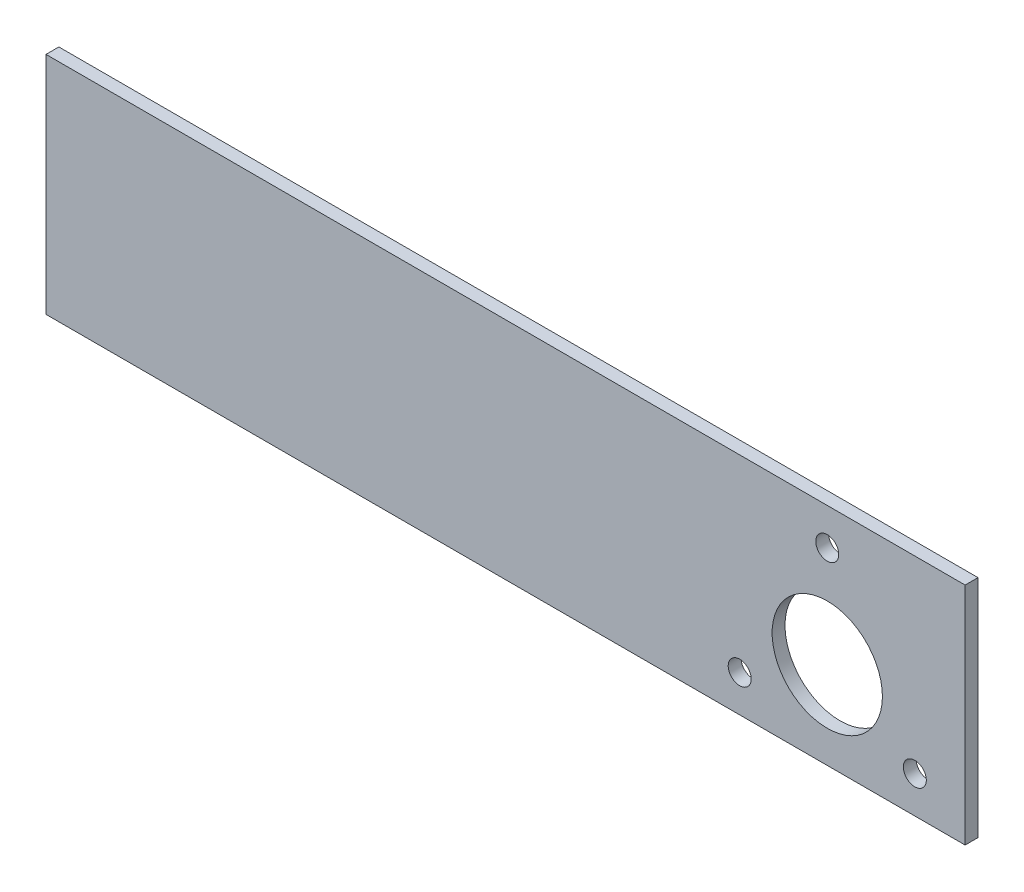
ISO-10303-21;
HEADER;
FILE_DESCRIPTION(('STEP AP214'),'2;1');
FILE_NAME('part.step','',(''),(''),'','','');
FILE_SCHEMA(('AUTOMOTIVE_DESIGN { 1 0 10303 214 1 1 1 1 }'));
ENDSEC;
DATA;
#1=APPLICATION_CONTEXT('core data for automotive mechanical design processes');
#2=APPLICATION_PROTOCOL_DEFINITION('international standard','automotive_design',2000,#1);
#3=PRODUCT_CONTEXT('',#1,'mechanical');
#4=PRODUCT('Part','Part','',(#3));
#5=PRODUCT_RELATED_PRODUCT_CATEGORY('part','',(#4));
#6=PRODUCT_DEFINITION_FORMATION('','',#4);
#7=PRODUCT_DEFINITION_CONTEXT('part definition',#1,'design');
#8=PRODUCT_DEFINITION('design','',#6,#7);
#9=PRODUCT_DEFINITION_SHAPE('','',#8);
#10=(LENGTH_UNIT() NAMED_UNIT(*) SI_UNIT(.MILLI.,.METRE.));
#11=(NAMED_UNIT(*) PLANE_ANGLE_UNIT() SI_UNIT($,.RADIAN.));
#12=(NAMED_UNIT(*) SI_UNIT($,.STERADIAN.) SOLID_ANGLE_UNIT());
#13=UNCERTAINTY_MEASURE_WITH_UNIT(LENGTH_MEASURE(1.E-05),#10,'distance_accuracy_value','');
#14=(GEOMETRIC_REPRESENTATION_CONTEXT(3) GLOBAL_UNCERTAINTY_ASSIGNED_CONTEXT((#13)) GLOBAL_UNIT_ASSIGNED_CONTEXT((#10,
#11,#12)) REPRESENTATION_CONTEXT('',''));
#15=CARTESIAN_POINT('',(0.,0.,0.));
#16=DIRECTION('',(0.,0.,1.));
#17=DIRECTION('',(1.,0.,0.));
#18=AXIS2_PLACEMENT_3D('',#15,#16,#17);
#19=CARTESIAN_POINT('',(-85.,-9.5,-1.4));
#20=DIRECTION('',(-1.,0.,0.));
#21=DIRECTION('',(0.,0.,1.));
#22=AXIS2_PLACEMENT_3D('',#19,#20,#21);
#23=PLANE('',#22);
#24=DIRECTION('',(0.,-1.,0.));
#25=VECTOR('',#24,1.);
#26=CARTESIAN_POINT('',(-85.,-9.5,0.));
#27=LINE('',#26,#25);
#28=CARTESIAN_POINT('',(-85.,15.,0.));
#29=VERTEX_POINT('',#28);
#30=CARTESIAN_POINT('',(-85.,-9.5,0.));
#31=VERTEX_POINT('',#30);
#32=EDGE_CURVE('E104',#29,#31,#27,.T.);
#33=ORIENTED_EDGE('',*,*,#32,.F.);
#34=DIRECTION('',(0.,0.,1.));
#35=VECTOR('',#34,1.);
#36=CARTESIAN_POINT('',(-85.,15.,-1.4));
#37=LINE('',#36,#35);
#38=CARTESIAN_POINT('',(-85.,15.,-1.4));
#39=VERTEX_POINT('',#38);
#40=EDGE_CURVE('E11',#39,#29,#37,.T.);
#41=ORIENTED_EDGE('',*,*,#40,.F.);
#42=DIRECTION('',(0.,-1.,0.));
#43=VECTOR('',#42,1.);
#44=CARTESIAN_POINT('',(-85.,-9.5,-1.4));
#45=LINE('',#44,#43);
#46=CARTESIAN_POINT('',(-85.,-9.5,-1.4));
#47=VERTEX_POINT('',#46);
#48=EDGE_CURVE('E97',#39,#47,#45,.T.);
#49=ORIENTED_EDGE('',*,*,#48,.T.);
#50=DIRECTION('',(0.,0.,1.));
#51=VECTOR('',#50,1.);
#52=CARTESIAN_POINT('',(-85.,-9.5,-1.4));
#53=LINE('',#52,#51);
#54=EDGE_CURVE('E42',#47,#31,#53,.T.);
#55=ORIENTED_EDGE('',*,*,#54,.T.);
#56=EDGE_LOOP('',(#33,#41,#49,#55));
#57=FACE_BOUND('',#56,.T.);
#58=ADVANCED_FACE('F39',(#57),#23,.T.);
#59=CARTESIAN_POINT('',(-85.,15.,-1.4));
#60=DIRECTION('',(0.,1.,0.));
#61=DIRECTION('',(-1.,0.,0.));
#62=AXIS2_PLACEMENT_3D('',#59,#60,#61);
#63=PLANE('',#62);
#64=DIRECTION('',(-1.,0.,0.));
#65=VECTOR('',#64,1.);
#66=CARTESIAN_POINT('',(-85.,15.,0.));
#67=LINE('',#66,#65);
#68=CARTESIAN_POINT('',(15.,15.,0.));
#69=VERTEX_POINT('',#68);
#70=EDGE_CURVE('E99',#69,#29,#67,.T.);
#71=ORIENTED_EDGE('',*,*,#70,.F.);
#72=DIRECTION('',(0.,0.,1.));
#73=VECTOR('',#72,1.);
#74=CARTESIAN_POINT('',(15.,15.,-1.4));
#75=LINE('',#74,#73);
#76=CARTESIAN_POINT('',(15.,15.,-1.4));
#77=VERTEX_POINT('',#76);
#78=EDGE_CURVE('E48',#77,#69,#75,.T.);
#79=ORIENTED_EDGE('',*,*,#78,.F.);
#80=DIRECTION('',(-1.,0.,0.));
#81=VECTOR('',#80,1.);
#82=CARTESIAN_POINT('',(-85.,15.,-1.4));
#83=LINE('',#82,#81);
#84=EDGE_CURVE('E94',#77,#39,#83,.T.);
#85=ORIENTED_EDGE('',*,*,#84,.T.);
#86=ORIENTED_EDGE('',*,*,#40,.T.);
#87=EDGE_LOOP('',(#71,#79,#85,#86));
#88=FACE_BOUND('',#87,.T.);
#89=ADVANCED_FACE('F115',(#88),#63,.T.);
#90=CARTESIAN_POINT('',(15.,-9.5,-1.4));
#91=DIRECTION('',(1.,0.,0.));
#92=DIRECTION('',(0.,0.,-1.));
#93=AXIS2_PLACEMENT_3D('',#90,#91,#92);
#94=PLANE('',#93);
#95=DIRECTION('',(0.,1.,0.));
#96=VECTOR('',#95,1.);
#97=CARTESIAN_POINT('',(15.,-9.5,0.));
#98=LINE('',#97,#96);
#99=CARTESIAN_POINT('',(15.,-9.5,0.));
#100=VERTEX_POINT('',#99);
#101=EDGE_CURVE('E89',#100,#69,#98,.T.);
#102=ORIENTED_EDGE('',*,*,#101,.F.);
#103=DIRECTION('',(0.,0.,1.));
#104=VECTOR('',#103,1.);
#105=CARTESIAN_POINT('',(15.,-9.5,-1.4));
#106=LINE('',#105,#104);
#107=CARTESIAN_POINT('',(15.,-9.5,-1.4));
#108=VERTEX_POINT('',#107);
#109=EDGE_CURVE('E84',#108,#100,#106,.T.);
#110=ORIENTED_EDGE('',*,*,#109,.F.);
#111=DIRECTION('',(0.,1.,0.));
#112=VECTOR('',#111,1.);
#113=CARTESIAN_POINT('',(15.,-9.5,-1.4));
#114=LINE('',#113,#112);
#115=EDGE_CURVE('E87',#108,#77,#114,.T.);
#116=ORIENTED_EDGE('',*,*,#115,.T.);
#117=ORIENTED_EDGE('',*,*,#78,.T.);
#118=EDGE_LOOP('',(#102,#110,#116,#117));
#119=FACE_BOUND('',#118,.T.);
#120=ADVANCED_FACE('F86',(#119),#94,.T.);
#121=CARTESIAN_POINT('',(-85.,-9.5,-1.4));
#122=DIRECTION('',(0.,-1.,0.));
#123=DIRECTION('',(0.,0.,-1.));
#124=AXIS2_PLACEMENT_3D('',#121,#122,#123);
#125=PLANE('',#124);
#126=DIRECTION('',(1.,0.,0.));
#127=VECTOR('',#126,1.);
#128=CARTESIAN_POINT('',(-85.,-9.5,0.));
#129=LINE('',#128,#127);
#130=EDGE_CURVE('E107',#31,#100,#129,.T.);
#131=ORIENTED_EDGE('',*,*,#130,.F.);
#132=ORIENTED_EDGE('',*,*,#54,.F.);
#133=DIRECTION('',(1.,0.,0.));
#134=VECTOR('',#133,1.);
#135=CARTESIAN_POINT('',(-85.,-9.5,-1.4));
#136=LINE('',#135,#134);
#137=EDGE_CURVE('E93',#47,#108,#136,.T.);
#138=ORIENTED_EDGE('',*,*,#137,.T.);
#139=ORIENTED_EDGE('',*,*,#109,.T.);
#140=EDGE_LOOP('',(#131,#132,#138,#139));
#141=FACE_BOUND('',#140,.T.);
#142=ADVANCED_FACE('F96',(#141),#125,.T.);
#143=CARTESIAN_POINT('',(0.,0.,-1.4));
#144=DIRECTION('',(0.,0.,-1.));
#145=DIRECTION('',(-1.,0.,0.));
#146=AXIS2_PLACEMENT_3D('',#143,#144,#145);
#147=PLANE('',#146);
#148=CARTESIAN_POINT('',(0.,11.,-1.4));
#149=DIRECTION('',(0.,0.,-1.));
#150=DIRECTION('',(-1.,0.,0.));
#151=AXIS2_PLACEMENT_3D('',#148,#149,#150);
#152=CIRCLE('',#151,1.25);
#153=CARTESIAN_POINT('',(-1.25,11.,-1.4));
#154=VERTEX_POINT('',#153);
#155=EDGE_CURVE('E108',#154,#154,#152,.T.);
#156=ORIENTED_EDGE('',*,*,#155,.F.);
#157=EDGE_LOOP('',(#156));
#158=FACE_BOUND('',#157,.T.);
#159=CARTESIAN_POINT('',(0.,0.,-1.4));
#160=DIRECTION('',(0.,0.,-1.));
#161=DIRECTION('',(-1.,0.,0.));
#162=AXIS2_PLACEMENT_3D('',#159,#160,#161);
#163=CIRCLE('',#162,6.);
#164=CARTESIAN_POINT('',(-6.,0.,-1.4));
#165=VERTEX_POINT('',#164);
#166=EDGE_CURVE('E176',#165,#165,#163,.T.);
#167=ORIENTED_EDGE('',*,*,#166,.F.);
#168=EDGE_LOOP('',(#167));
#169=FACE_BOUND('',#168,.T.);
#170=CARTESIAN_POINT('',(9.526279441629,-5.5,-1.4));
#171=DIRECTION('',(0.,0.,-1.));
#172=DIRECTION('',(-1.,0.,0.));
#173=AXIS2_PLACEMENT_3D('',#170,#171,#172);
#174=CIRCLE('',#173,1.25000000000039);
#175=CARTESIAN_POINT('',(8.27627944162861,-5.5,-1.4));
#176=VERTEX_POINT('',#175);
#177=EDGE_CURVE('E163',#176,#176,#174,.T.);
#178=ORIENTED_EDGE('',*,*,#177,.F.);
#179=EDGE_LOOP('',(#178));
#180=FACE_BOUND('',#179,.T.);
#181=CARTESIAN_POINT('',(-9.526279441629,-5.5,-1.4));
#182=DIRECTION('',(0.,0.,-1.));
#183=DIRECTION('',(-1.,0.,0.));
#184=AXIS2_PLACEMENT_3D('',#181,#182,#183);
#185=CIRCLE('',#184,1.25000000000039);
#186=CARTESIAN_POINT('',(-10.7762794416294,-5.5,-1.4));
#187=VERTEX_POINT('',#186);
#188=EDGE_CURVE('E159',#187,#187,#185,.T.);
#189=ORIENTED_EDGE('',*,*,#188,.F.);
#190=EDGE_LOOP('',(#189));
#191=FACE_BOUND('',#190,.T.);
#192=ORIENTED_EDGE('',*,*,#48,.F.);
#193=ORIENTED_EDGE('',*,*,#84,.F.);
#194=ORIENTED_EDGE('',*,*,#115,.F.);
#195=ORIENTED_EDGE('',*,*,#137,.F.);
#196=EDGE_LOOP('',(#192,#193,#194,#195));
#197=FACE_BOUND('',#196,.T.);
#198=ADVANCED_FACE('F92',(#158,#169,#180,#191,#197),#147,.T.);
#199=CARTESIAN_POINT('',(0.,0.,0.));
#200=DIRECTION('',(0.,0.,-1.));
#201=DIRECTION('',(-1.,0.,0.));
#202=AXIS2_PLACEMENT_3D('',#199,#200,#201);
#203=PLANE('',#202);
#204=CARTESIAN_POINT('',(0.,11.,0.));
#205=DIRECTION('',(0.,0.,1.));
#206=DIRECTION('',(1.,0.,0.));
#207=AXIS2_PLACEMENT_3D('',#204,#205,#206);
#208=CIRCLE('',#207,1.25);
#209=CARTESIAN_POINT('',(1.25,11.,0.));
#210=VERTEX_POINT('',#209);
#211=EDGE_CURVE('E158',#210,#210,#208,.T.);
#212=ORIENTED_EDGE('',*,*,#211,.F.);
#213=EDGE_LOOP('',(#212));
#214=FACE_BOUND('',#213,.T.);
#215=CARTESIAN_POINT('',(0.,0.,0.));
#216=DIRECTION('',(0.,0.,1.));
#217=DIRECTION('',(1.,0.,0.));
#218=AXIS2_PLACEMENT_3D('',#215,#216,#217);
#219=CIRCLE('',#218,6.);
#220=CARTESIAN_POINT('',(6.,0.,0.));
#221=VERTEX_POINT('',#220);
#222=EDGE_CURVE('E169',#221,#221,#219,.T.);
#223=ORIENTED_EDGE('',*,*,#222,.F.);
#224=EDGE_LOOP('',(#223));
#225=FACE_BOUND('',#224,.T.);
#226=CARTESIAN_POINT('',(9.526279441629,-5.5,0.));
#227=DIRECTION('',(0.,0.,1.));
#228=DIRECTION('',(1.,0.,0.));
#229=AXIS2_PLACEMENT_3D('',#226,#227,#228);
#230=CIRCLE('',#229,1.25000000000039);
#231=CARTESIAN_POINT('',(10.7762794416294,-5.5,0.));
#232=VERTEX_POINT('',#231);
#233=EDGE_CURVE('E166',#232,#232,#230,.T.);
#234=ORIENTED_EDGE('',*,*,#233,.F.);
#235=EDGE_LOOP('',(#234));
#236=FACE_BOUND('',#235,.T.);
#237=CARTESIAN_POINT('',(-9.526279441629,-5.5,0.));
#238=DIRECTION('',(0.,0.,1.));
#239=DIRECTION('',(1.,0.,0.));
#240=AXIS2_PLACEMENT_3D('',#237,#238,#239);
#241=CIRCLE('',#240,1.25000000000039);
#242=CARTESIAN_POINT('',(-8.27627944162861,-5.5,0.));
#243=VERTEX_POINT('',#242);
#244=EDGE_CURVE('E160',#243,#243,#241,.T.);
#245=ORIENTED_EDGE('',*,*,#244,.F.);
#246=EDGE_LOOP('',(#245));
#247=FACE_BOUND('',#246,.T.);
#248=ORIENTED_EDGE('',*,*,#32,.T.);
#249=ORIENTED_EDGE('',*,*,#130,.T.);
#250=ORIENTED_EDGE('',*,*,#101,.T.);
#251=ORIENTED_EDGE('',*,*,#70,.T.);
#252=EDGE_LOOP('',(#248,#249,#250,#251));
#253=FACE_BOUND('',#252,.T.);
#254=ADVANCED_FACE('F114',(#214,#225,#236,#247,#253),#203,.F.);
#255=CARTESIAN_POINT('',(-9.526279441629,-5.5,-10.));
#256=DIRECTION('',(0.,0.,1.));
#257=DIRECTION('',(1.,0.,0.));
#258=AXIS2_PLACEMENT_3D('',#255,#256,#257);
#259=CYLINDRICAL_SURFACE('',#258,1.25000000000039);
#260=ORIENTED_EDGE('',*,*,#188,.T.);
#261=EDGE_LOOP('',(#260));
#262=FACE_BOUND('',#261,.T.);
#263=ORIENTED_EDGE('',*,*,#244,.T.);
#264=EDGE_LOOP('',(#263));
#265=FACE_BOUND('',#264,.T.);
#266=ADVANCED_FACE('F133',(#262,#265),#259,.F.);
#267=CARTESIAN_POINT('',(9.526279441629,-5.5,-10.));
#268=DIRECTION('',(0.,0.,1.));
#269=DIRECTION('',(1.,0.,0.));
#270=AXIS2_PLACEMENT_3D('',#267,#268,#269);
#271=CYLINDRICAL_SURFACE('',#270,1.25000000000039);
#272=ORIENTED_EDGE('',*,*,#177,.T.);
#273=EDGE_LOOP('',(#272));
#274=FACE_BOUND('',#273,.T.);
#275=ORIENTED_EDGE('',*,*,#233,.T.);
#276=EDGE_LOOP('',(#275));
#277=FACE_BOUND('',#276,.T.);
#278=ADVANCED_FACE('F138',(#274,#277),#271,.F.);
#279=CARTESIAN_POINT('',(0.,0.,-10.));
#280=DIRECTION('',(0.,0.,1.));
#281=DIRECTION('',(1.,0.,0.));
#282=AXIS2_PLACEMENT_3D('',#279,#280,#281);
#283=CYLINDRICAL_SURFACE('',#282,6.);
#284=ORIENTED_EDGE('',*,*,#166,.T.);
#285=EDGE_LOOP('',(#284));
#286=FACE_BOUND('',#285,.T.);
#287=ORIENTED_EDGE('',*,*,#222,.T.);
#288=EDGE_LOOP('',(#287));
#289=FACE_BOUND('',#288,.T.);
#290=ADVANCED_FACE('F141',(#286,#289),#283,.F.);
#291=CARTESIAN_POINT('',(0.,11.,-10.));
#292=DIRECTION('',(0.,0.,1.));
#293=DIRECTION('',(1.,0.,0.));
#294=AXIS2_PLACEMENT_3D('',#291,#292,#293);
#295=CYLINDRICAL_SURFACE('',#294,1.25);
#296=ORIENTED_EDGE('',*,*,#155,.T.);
#297=EDGE_LOOP('',(#296));
#298=FACE_BOUND('',#297,.T.);
#299=ORIENTED_EDGE('',*,*,#211,.T.);
#300=EDGE_LOOP('',(#299));
#301=FACE_BOUND('',#300,.T.);
#302=ADVANCED_FACE('F148',(#298,#301),#295,.F.);
#303=CLOSED_SHELL('',(#58,#89,#120,#142,#198,#254,#266,#278,#290,#302));
#304=MANIFOLD_SOLID_BREP('B2',#303);
#305=ADVANCED_BREP_SHAPE_REPRESENTATION('',(#18,#304),#14);
#306=SHAPE_DEFINITION_REPRESENTATION(#9,#305);
ENDSEC;
END-ISO-10303-21;
